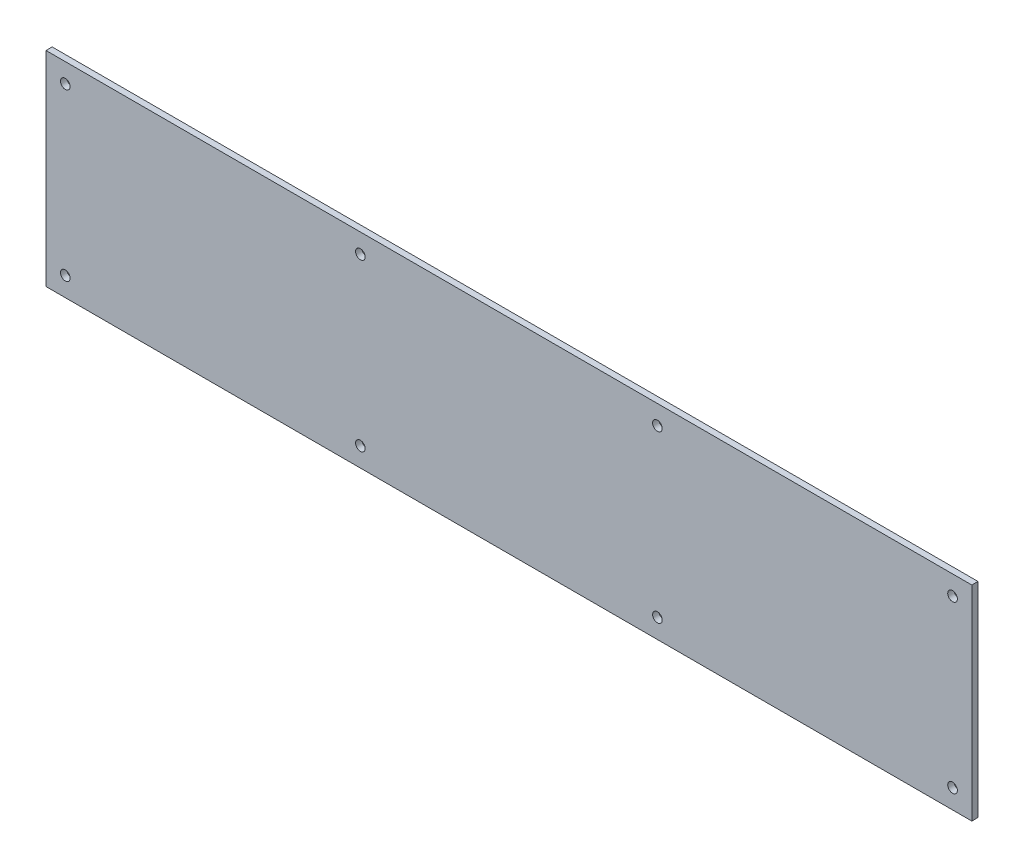
ISO-10303-21;
HEADER;
FILE_DESCRIPTION(('STEP AP214'),'2;1');
FILE_NAME('part.step','',(''),(''),'','','');
FILE_SCHEMA(('AUTOMOTIVE_DESIGN { 1 0 10303 214 1 1 1 1 }'));
ENDSEC;
DATA;
#1=APPLICATION_CONTEXT('core data for automotive mechanical design processes');
#2=APPLICATION_PROTOCOL_DEFINITION('international standard','automotive_design',2000,#1);
#3=PRODUCT_CONTEXT('',#1,'mechanical');
#4=PRODUCT('Part','Part','',(#3));
#5=PRODUCT_RELATED_PRODUCT_CATEGORY('part','',(#4));
#6=PRODUCT_DEFINITION_FORMATION('','',#4);
#7=PRODUCT_DEFINITION_CONTEXT('part definition',#1,'design');
#8=PRODUCT_DEFINITION('design','',#6,#7);
#9=PRODUCT_DEFINITION_SHAPE('','',#8);
#10=(LENGTH_UNIT() NAMED_UNIT(*) SI_UNIT(.MILLI.,.METRE.));
#11=(NAMED_UNIT(*) PLANE_ANGLE_UNIT() SI_UNIT($,.RADIAN.));
#12=(NAMED_UNIT(*) SI_UNIT($,.STERADIAN.) SOLID_ANGLE_UNIT());
#13=UNCERTAINTY_MEASURE_WITH_UNIT(LENGTH_MEASURE(1.E-05),#10,'distance_accuracy_value','');
#14=(GEOMETRIC_REPRESENTATION_CONTEXT(3) GLOBAL_UNCERTAINTY_ASSIGNED_CONTEXT((#13)) GLOBAL_UNIT_ASSIGNED_CONTEXT((#10,
#11,#12)) REPRESENTATION_CONTEXT('',''));
#15=CARTESIAN_POINT('',(0.,0.,0.));
#16=DIRECTION('',(0.,0.,1.));
#17=DIRECTION('',(1.,0.,0.));
#18=AXIS2_PLACEMENT_3D('',#15,#16,#17);
#19=CARTESIAN_POINT('',(-304.8,228.6,2.032));
#20=DIRECTION('',(1.,0.,0.));
#21=DIRECTION('',(0.,0.,-1.));
#22=AXIS2_PLACEMENT_3D('',#19,#20,#21);
#23=PLANE('',#22);
#24=DIRECTION('',(0.,-1.,0.));
#25=VECTOR('',#24,1.);
#26=CARTESIAN_POINT('',(-304.8,228.6,0.));
#27=LINE('',#26,#25);
#28=CARTESIAN_POINT('',(-304.8,228.6,0.));
#29=VERTEX_POINT('',#28);
#30=CARTESIAN_POINT('',(-304.8,161.29,0.));
#31=VERTEX_POINT('',#30);
#32=EDGE_CURVE('E94',#29,#31,#27,.T.);
#33=ORIENTED_EDGE('',*,*,#32,.T.);
#34=DIRECTION('',(0.,0.,-1.));
#35=VECTOR('',#34,1.);
#36=CARTESIAN_POINT('',(-304.8,161.29,2.032));
#37=LINE('',#36,#35);
#38=CARTESIAN_POINT('',(-304.8,161.29,2.032));
#39=VERTEX_POINT('',#38);
#40=EDGE_CURVE('E11',#39,#31,#37,.T.);
#41=ORIENTED_EDGE('',*,*,#40,.F.);
#42=DIRECTION('',(0.,-1.,0.));
#43=VECTOR('',#42,1.);
#44=CARTESIAN_POINT('',(-304.8,228.6,2.032));
#45=LINE('',#44,#43);
#46=CARTESIAN_POINT('',(-304.8,228.6,2.032));
#47=VERTEX_POINT('',#46);
#48=EDGE_CURVE('E82',#47,#39,#45,.T.);
#49=ORIENTED_EDGE('',*,*,#48,.F.);
#50=DIRECTION('',(0.,0.,-1.));
#51=VECTOR('',#50,1.);
#52=CARTESIAN_POINT('',(-304.8,228.6,2.032));
#53=LINE('',#52,#51);
#54=EDGE_CURVE('E90',#47,#29,#53,.T.);
#55=ORIENTED_EDGE('',*,*,#54,.T.);
#56=EDGE_LOOP('',(#33,#41,#49,#55));
#57=FACE_BOUND('',#56,.T.);
#58=ADVANCED_FACE('F31',(#57),#23,.F.);
#59=CARTESIAN_POINT('',(-304.8,161.29,2.032));
#60=DIRECTION('',(0.,1.,0.));
#61=DIRECTION('',(0.,0.,1.));
#62=AXIS2_PLACEMENT_3D('',#59,#60,#61);
#63=PLANE('',#62);
#64=DIRECTION('',(1.,0.,0.));
#65=VECTOR('',#64,1.);
#66=CARTESIAN_POINT('',(-304.8,161.29,0.));
#67=LINE('',#66,#65);
#68=CARTESIAN_POINT('',(0.,161.29,0.));
#69=VERTEX_POINT('',#68);
#70=EDGE_CURVE('E86',#31,#69,#67,.T.);
#71=ORIENTED_EDGE('',*,*,#70,.T.);
#72=DIRECTION('',(0.,0.,-1.));
#73=VECTOR('',#72,1.);
#74=CARTESIAN_POINT('',(0.,161.29,2.032));
#75=LINE('',#74,#73);
#76=CARTESIAN_POINT('',(0.,161.29,2.032));
#77=VERTEX_POINT('',#76);
#78=EDGE_CURVE('E39',#77,#69,#75,.T.);
#79=ORIENTED_EDGE('',*,*,#78,.F.);
#80=DIRECTION('',(1.,0.,0.));
#81=VECTOR('',#80,1.);
#82=CARTESIAN_POINT('',(-304.8,161.29,2.032));
#83=LINE('',#82,#81);
#84=EDGE_CURVE('E77',#39,#77,#83,.T.);
#85=ORIENTED_EDGE('',*,*,#84,.F.);
#86=ORIENTED_EDGE('',*,*,#40,.T.);
#87=EDGE_LOOP('',(#71,#79,#85,#86));
#88=FACE_BOUND('',#87,.T.);
#89=ADVANCED_FACE('F85',(#88),#63,.F.);
#90=CARTESIAN_POINT('',(0.,228.6,2.032));
#91=DIRECTION('',(-1.,0.,0.));
#92=DIRECTION('',(0.,0.,1.));
#93=AXIS2_PLACEMENT_3D('',#90,#91,#92);
#94=PLANE('',#93);
#95=DIRECTION('',(0.,1.,0.));
#96=VECTOR('',#95,1.);
#97=CARTESIAN_POINT('',(0.,228.6,0.));
#98=LINE('',#97,#96);
#99=CARTESIAN_POINT('',(0.,228.6,0.));
#100=VERTEX_POINT('',#99);
#101=EDGE_CURVE('E64',#69,#100,#98,.T.);
#102=ORIENTED_EDGE('',*,*,#101,.T.);
#103=DIRECTION('',(0.,0.,-1.));
#104=VECTOR('',#103,1.);
#105=CARTESIAN_POINT('',(0.,228.6,2.032));
#106=LINE('',#105,#104);
#107=CARTESIAN_POINT('',(0.,228.6,2.032));
#108=VERTEX_POINT('',#107);
#109=EDGE_CURVE('E87',#108,#100,#106,.T.);
#110=ORIENTED_EDGE('',*,*,#109,.F.);
#111=DIRECTION('',(0.,1.,0.));
#112=VECTOR('',#111,1.);
#113=CARTESIAN_POINT('',(0.,228.6,2.032));
#114=LINE('',#113,#112);
#115=EDGE_CURVE('E80',#77,#108,#114,.T.);
#116=ORIENTED_EDGE('',*,*,#115,.F.);
#117=ORIENTED_EDGE('',*,*,#78,.T.);
#118=EDGE_LOOP('',(#102,#110,#116,#117));
#119=FACE_BOUND('',#118,.T.);
#120=ADVANCED_FACE('F88',(#119),#94,.F.);
#121=CARTESIAN_POINT('',(-304.8,228.6,2.032));
#122=DIRECTION('',(0.,-1.,0.));
#123=DIRECTION('',(0.,0.,-1.));
#124=AXIS2_PLACEMENT_3D('',#121,#122,#123);
#125=PLANE('',#124);
#126=DIRECTION('',(-1.,0.,0.));
#127=VECTOR('',#126,1.);
#128=CARTESIAN_POINT('',(-304.8,228.6,0.));
#129=LINE('',#128,#127);
#130=EDGE_CURVE('E70',#100,#29,#129,.T.);
#131=ORIENTED_EDGE('',*,*,#130,.T.);
#132=ORIENTED_EDGE('',*,*,#54,.F.);
#133=DIRECTION('',(-1.,0.,0.));
#134=VECTOR('',#133,1.);
#135=CARTESIAN_POINT('',(-304.8,228.6,2.032));
#136=LINE('',#135,#134);
#137=EDGE_CURVE('E47',#108,#47,#136,.T.);
#138=ORIENTED_EDGE('',*,*,#137,.F.);
#139=ORIENTED_EDGE('',*,*,#109,.T.);
#140=EDGE_LOOP('',(#131,#132,#138,#139));
#141=FACE_BOUND('',#140,.T.);
#142=ADVANCED_FACE('F102',(#141),#125,.F.);
#143=CARTESIAN_POINT('',(-304.8,161.29,2.032));
#144=DIRECTION('',(0.,0.,1.));
#145=DIRECTION('',(1.,0.,0.));
#146=AXIS2_PLACEMENT_3D('',#143,#144,#145);
#147=PLANE('',#146);
#148=CARTESIAN_POINT('',(-103.505,222.25,2.032));
#149=DIRECTION('',(0.,0.,1.));
#150=DIRECTION('',(-1.,0.,0.));
#151=AXIS2_PLACEMENT_3D('',#148,#149,#150);
#152=CIRCLE('',#151,1.58749999999999);
#153=CARTESIAN_POINT('',(-105.0925,222.25,2.032));
#154=VERTEX_POINT('',#153);
#155=EDGE_CURVE('E150',#154,#154,#152,.T.);
#156=ORIENTED_EDGE('',*,*,#155,.F.);
#157=EDGE_LOOP('',(#156));
#158=FACE_BOUND('',#157,.T.);
#159=CARTESIAN_POINT('',(-6.34999999999997,222.25,2.032));
#160=DIRECTION('',(0.,0.,1.));
#161=DIRECTION('',(-1.,0.,0.));
#162=AXIS2_PLACEMENT_3D('',#159,#160,#161);
#163=CIRCLE('',#162,1.58750000000003);
#164=CARTESIAN_POINT('',(-7.9375,222.25,2.032));
#165=VERTEX_POINT('',#164);
#166=EDGE_CURVE('E144',#165,#165,#163,.T.);
#167=ORIENTED_EDGE('',*,*,#166,.F.);
#168=EDGE_LOOP('',(#167));
#169=FACE_BOUND('',#168,.T.);
#170=CARTESIAN_POINT('',(-6.34999999999997,167.64,2.032));
#171=DIRECTION('',(0.,0.,1.));
#172=DIRECTION('',(-1.,0.,0.));
#173=AXIS2_PLACEMENT_3D('',#170,#171,#172);
#174=CIRCLE('',#173,1.58750000000003);
#175=CARTESIAN_POINT('',(-7.93749999999999,167.64,2.032));
#176=VERTEX_POINT('',#175);
#177=EDGE_CURVE('E138',#176,#176,#174,.T.);
#178=ORIENTED_EDGE('',*,*,#177,.F.);
#179=EDGE_LOOP('',(#178));
#180=FACE_BOUND('',#179,.T.);
#181=CARTESIAN_POINT('',(-103.505,167.64,2.032));
#182=DIRECTION('',(0.,0.,1.));
#183=DIRECTION('',(-1.,0.,0.));
#184=AXIS2_PLACEMENT_3D('',#181,#182,#183);
#185=CIRCLE('',#184,1.58750000000005);
#186=CARTESIAN_POINT('',(-105.0925,167.64,2.032));
#187=VERTEX_POINT('',#186);
#188=EDGE_CURVE('E132',#187,#187,#185,.T.);
#189=ORIENTED_EDGE('',*,*,#188,.F.);
#190=EDGE_LOOP('',(#189));
#191=FACE_BOUND('',#190,.T.);
#192=CARTESIAN_POINT('',(-201.295,167.64,2.032));
#193=DIRECTION('',(0.,0.,1.));
#194=DIRECTION('',(1.,0.,0.));
#195=AXIS2_PLACEMENT_3D('',#192,#193,#194);
#196=CIRCLE('',#195,1.58750000000005);
#197=CARTESIAN_POINT('',(-199.7075,167.64,2.032));
#198=VERTEX_POINT('',#197);
#199=EDGE_CURVE('E126',#198,#198,#196,.T.);
#200=ORIENTED_EDGE('',*,*,#199,.F.);
#201=EDGE_LOOP('',(#200));
#202=FACE_BOUND('',#201,.T.);
#203=CARTESIAN_POINT('',(-298.45,167.64,2.032));
#204=DIRECTION('',(0.,0.,1.));
#205=DIRECTION('',(1.,0.,0.));
#206=AXIS2_PLACEMENT_3D('',#203,#204,#205);
#207=CIRCLE('',#206,1.58750000000004);
#208=CARTESIAN_POINT('',(-296.8625,167.64,2.032));
#209=VERTEX_POINT('',#208);
#210=EDGE_CURVE('E120',#209,#209,#207,.T.);
#211=ORIENTED_EDGE('',*,*,#210,.F.);
#212=EDGE_LOOP('',(#211));
#213=FACE_BOUND('',#212,.T.);
#214=CARTESIAN_POINT('',(-298.45,222.25,2.032));
#215=DIRECTION('',(0.,0.,1.));
#216=DIRECTION('',(1.,0.,0.));
#217=AXIS2_PLACEMENT_3D('',#214,#215,#216);
#218=CIRCLE('',#217,1.58750000000004);
#219=CARTESIAN_POINT('',(-296.8625,222.25,2.032));
#220=VERTEX_POINT('',#219);
#221=EDGE_CURVE('E114',#220,#220,#218,.T.);
#222=ORIENTED_EDGE('',*,*,#221,.F.);
#223=EDGE_LOOP('',(#222));
#224=FACE_BOUND('',#223,.T.);
#225=CARTESIAN_POINT('',(-201.295,222.25,2.032));
#226=DIRECTION('',(0.,0.,1.));
#227=DIRECTION('',(1.,0.,0.));
#228=AXIS2_PLACEMENT_3D('',#225,#226,#227);
#229=CIRCLE('',#228,1.58749999999999);
#230=CARTESIAN_POINT('',(-199.7075,222.25,2.032));
#231=VERTEX_POINT('',#230);
#232=EDGE_CURVE('E108',#231,#231,#229,.T.);
#233=ORIENTED_EDGE('',*,*,#232,.F.);
#234=EDGE_LOOP('',(#233));
#235=FACE_BOUND('',#234,.T.);
#236=ORIENTED_EDGE('',*,*,#48,.T.);
#237=ORIENTED_EDGE('',*,*,#84,.T.);
#238=ORIENTED_EDGE('',*,*,#115,.T.);
#239=ORIENTED_EDGE('',*,*,#137,.T.);
#240=EDGE_LOOP('',(#236,#237,#238,#239));
#241=FACE_BOUND('',#240,.T.);
#242=ADVANCED_FACE('F78',(#158,#169,#180,#191,#202,#213,#224,#235,#241),#147,.T.);
#243=CARTESIAN_POINT('',(-304.8,161.29,0.));
#244=DIRECTION('',(0.,0.,1.));
#245=DIRECTION('',(1.,0.,0.));
#246=AXIS2_PLACEMENT_3D('',#243,#244,#245);
#247=PLANE('',#246);
#248=CARTESIAN_POINT('',(-103.505,222.25,0.));
#249=DIRECTION('',(0.,0.,1.));
#250=DIRECTION('',(-1.,0.,0.));
#251=AXIS2_PLACEMENT_3D('',#248,#249,#250);
#252=CIRCLE('',#251,1.58749999999999);
#253=CARTESIAN_POINT('',(-105.0925,222.25,0.));
#254=VERTEX_POINT('',#253);
#255=EDGE_CURVE('E147',#254,#254,#252,.T.);
#256=ORIENTED_EDGE('',*,*,#255,.T.);
#257=EDGE_LOOP('',(#256));
#258=FACE_BOUND('',#257,.T.);
#259=CARTESIAN_POINT('',(-6.34999999999997,222.25,0.));
#260=DIRECTION('',(0.,0.,1.));
#261=DIRECTION('',(-1.,0.,0.));
#262=AXIS2_PLACEMENT_3D('',#259,#260,#261);
#263=CIRCLE('',#262,1.58750000000003);
#264=CARTESIAN_POINT('',(-7.9375,222.25,0.));
#265=VERTEX_POINT('',#264);
#266=EDGE_CURVE('E141',#265,#265,#263,.T.);
#267=ORIENTED_EDGE('',*,*,#266,.T.);
#268=EDGE_LOOP('',(#267));
#269=FACE_BOUND('',#268,.T.);
#270=CARTESIAN_POINT('',(-6.34999999999997,167.64,0.));
#271=DIRECTION('',(0.,0.,1.));
#272=DIRECTION('',(-1.,0.,0.));
#273=AXIS2_PLACEMENT_3D('',#270,#271,#272);
#274=CIRCLE('',#273,1.58750000000003);
#275=CARTESIAN_POINT('',(-7.93749999999999,167.64,0.));
#276=VERTEX_POINT('',#275);
#277=EDGE_CURVE('E135',#276,#276,#274,.T.);
#278=ORIENTED_EDGE('',*,*,#277,.T.);
#279=EDGE_LOOP('',(#278));
#280=FACE_BOUND('',#279,.T.);
#281=CARTESIAN_POINT('',(-103.505,167.64,0.));
#282=DIRECTION('',(0.,0.,1.));
#283=DIRECTION('',(-1.,0.,0.));
#284=AXIS2_PLACEMENT_3D('',#281,#282,#283);
#285=CIRCLE('',#284,1.58750000000005);
#286=CARTESIAN_POINT('',(-105.0925,167.64,0.));
#287=VERTEX_POINT('',#286);
#288=EDGE_CURVE('E129',#287,#287,#285,.T.);
#289=ORIENTED_EDGE('',*,*,#288,.T.);
#290=EDGE_LOOP('',(#289));
#291=FACE_BOUND('',#290,.T.);
#292=CARTESIAN_POINT('',(-201.295,167.64,0.));
#293=DIRECTION('',(0.,0.,1.));
#294=DIRECTION('',(1.,0.,0.));
#295=AXIS2_PLACEMENT_3D('',#292,#293,#294);
#296=CIRCLE('',#295,1.58750000000005);
#297=CARTESIAN_POINT('',(-199.7075,167.64,0.));
#298=VERTEX_POINT('',#297);
#299=EDGE_CURVE('E123',#298,#298,#296,.T.);
#300=ORIENTED_EDGE('',*,*,#299,.T.);
#301=EDGE_LOOP('',(#300));
#302=FACE_BOUND('',#301,.T.);
#303=CARTESIAN_POINT('',(-298.45,167.64,0.));
#304=DIRECTION('',(0.,0.,1.));
#305=DIRECTION('',(1.,0.,0.));
#306=AXIS2_PLACEMENT_3D('',#303,#304,#305);
#307=CIRCLE('',#306,1.58750000000004);
#308=CARTESIAN_POINT('',(-296.8625,167.64,0.));
#309=VERTEX_POINT('',#308);
#310=EDGE_CURVE('E117',#309,#309,#307,.T.);
#311=ORIENTED_EDGE('',*,*,#310,.T.);
#312=EDGE_LOOP('',(#311));
#313=FACE_BOUND('',#312,.T.);
#314=CARTESIAN_POINT('',(-298.45,222.25,0.));
#315=DIRECTION('',(0.,0.,1.));
#316=DIRECTION('',(1.,0.,0.));
#317=AXIS2_PLACEMENT_3D('',#314,#315,#316);
#318=CIRCLE('',#317,1.58750000000004);
#319=CARTESIAN_POINT('',(-296.8625,222.25,0.));
#320=VERTEX_POINT('',#319);
#321=EDGE_CURVE('E111',#320,#320,#318,.T.);
#322=ORIENTED_EDGE('',*,*,#321,.T.);
#323=EDGE_LOOP('',(#322));
#324=FACE_BOUND('',#323,.T.);
#325=CARTESIAN_POINT('',(-201.295,222.25,0.));
#326=DIRECTION('',(0.,0.,1.));
#327=DIRECTION('',(1.,0.,0.));
#328=AXIS2_PLACEMENT_3D('',#325,#326,#327);
#329=CIRCLE('',#328,1.58749999999999);
#330=CARTESIAN_POINT('',(-199.7075,222.25,0.));
#331=VERTEX_POINT('',#330);
#332=EDGE_CURVE('E97',#331,#331,#329,.T.);
#333=ORIENTED_EDGE('',*,*,#332,.T.);
#334=EDGE_LOOP('',(#333));
#335=FACE_BOUND('',#334,.T.);
#336=ORIENTED_EDGE('',*,*,#32,.F.);
#337=ORIENTED_EDGE('',*,*,#130,.F.);
#338=ORIENTED_EDGE('',*,*,#101,.F.);
#339=ORIENTED_EDGE('',*,*,#70,.F.);
#340=EDGE_LOOP('',(#336,#337,#338,#339));
#341=FACE_BOUND('',#340,.T.);
#342=ADVANCED_FACE('F105',(#258,#269,#280,#291,#302,#313,#324,#335,#341),#247,.F.);
#343=CARTESIAN_POINT('',(-201.295,222.25,0.));
#344=DIRECTION('',(0.,0.,1.));
#345=DIRECTION('',(1.,0.,0.));
#346=AXIS2_PLACEMENT_3D('',#343,#344,#345);
#347=CYLINDRICAL_SURFACE('',#346,1.58749999999999);
#348=ORIENTED_EDGE('',*,*,#332,.F.);
#349=EDGE_LOOP('',(#348));
#350=FACE_BOUND('',#349,.T.);
#351=ORIENTED_EDGE('',*,*,#232,.T.);
#352=EDGE_LOOP('',(#351));
#353=FACE_BOUND('',#352,.T.);
#354=ADVANCED_FACE('F182',(#350,#353),#347,.F.);
#355=CARTESIAN_POINT('',(-298.45,222.25,0.));
#356=DIRECTION('',(0.,0.,1.));
#357=DIRECTION('',(1.,0.,0.));
#358=AXIS2_PLACEMENT_3D('',#355,#356,#357);
#359=CYLINDRICAL_SURFACE('',#358,1.58750000000004);
#360=ORIENTED_EDGE('',*,*,#321,.F.);
#361=EDGE_LOOP('',(#360));
#362=FACE_BOUND('',#361,.T.);
#363=ORIENTED_EDGE('',*,*,#221,.T.);
#364=EDGE_LOOP('',(#363));
#365=FACE_BOUND('',#364,.T.);
#366=ADVANCED_FACE('F184',(#362,#365),#359,.F.);
#367=CARTESIAN_POINT('',(-298.45,167.64,0.));
#368=DIRECTION('',(0.,0.,1.));
#369=DIRECTION('',(1.,0.,0.));
#370=AXIS2_PLACEMENT_3D('',#367,#368,#369);
#371=CYLINDRICAL_SURFACE('',#370,1.58750000000004);
#372=ORIENTED_EDGE('',*,*,#310,.F.);
#373=EDGE_LOOP('',(#372));
#374=FACE_BOUND('',#373,.T.);
#375=ORIENTED_EDGE('',*,*,#210,.T.);
#376=EDGE_LOOP('',(#375));
#377=FACE_BOUND('',#376,.T.);
#378=ADVANCED_FACE('F191',(#374,#377),#371,.F.);
#379=CARTESIAN_POINT('',(-201.295,167.64,0.));
#380=DIRECTION('',(0.,0.,1.));
#381=DIRECTION('',(1.,0.,0.));
#382=AXIS2_PLACEMENT_3D('',#379,#380,#381);
#383=CYLINDRICAL_SURFACE('',#382,1.58750000000005);
#384=ORIENTED_EDGE('',*,*,#299,.F.);
#385=EDGE_LOOP('',(#384));
#386=FACE_BOUND('',#385,.T.);
#387=ORIENTED_EDGE('',*,*,#199,.T.);
#388=EDGE_LOOP('',(#387));
#389=FACE_BOUND('',#388,.T.);
#390=ADVANCED_FACE('F237',(#386,#389),#383,.F.);
#391=CARTESIAN_POINT('',(-103.505,167.64,0.));
#392=DIRECTION('',(0.,0.,1.));
#393=DIRECTION('',(1.,0.,0.));
#394=AXIS2_PLACEMENT_3D('',#391,#392,#393);
#395=CYLINDRICAL_SURFACE('',#394,1.58750000000005);
#396=ORIENTED_EDGE('',*,*,#288,.F.);
#397=EDGE_LOOP('',(#396));
#398=FACE_BOUND('',#397,.T.);
#399=ORIENTED_EDGE('',*,*,#188,.T.);
#400=EDGE_LOOP('',(#399));
#401=FACE_BOUND('',#400,.T.);
#402=ADVANCED_FACE('F247',(#398,#401),#395,.F.);
#403=CARTESIAN_POINT('',(-6.34999999999997,167.64,0.));
#404=DIRECTION('',(0.,0.,1.));
#405=DIRECTION('',(1.,0.,0.));
#406=AXIS2_PLACEMENT_3D('',#403,#404,#405);
#407=CYLINDRICAL_SURFACE('',#406,1.58750000000003);
#408=ORIENTED_EDGE('',*,*,#277,.F.);
#409=EDGE_LOOP('',(#408));
#410=FACE_BOUND('',#409,.T.);
#411=ORIENTED_EDGE('',*,*,#177,.T.);
#412=EDGE_LOOP('',(#411));
#413=FACE_BOUND('',#412,.T.);
#414=ADVANCED_FACE('F257',(#410,#413),#407,.F.);
#415=CARTESIAN_POINT('',(-6.34999999999997,222.25,0.));
#416=DIRECTION('',(0.,0.,1.));
#417=DIRECTION('',(1.,0.,0.));
#418=AXIS2_PLACEMENT_3D('',#415,#416,#417);
#419=CYLINDRICAL_SURFACE('',#418,1.58750000000003);
#420=ORIENTED_EDGE('',*,*,#266,.F.);
#421=EDGE_LOOP('',(#420));
#422=FACE_BOUND('',#421,.T.);
#423=ORIENTED_EDGE('',*,*,#166,.T.);
#424=EDGE_LOOP('',(#423));
#425=FACE_BOUND('',#424,.T.);
#426=ADVANCED_FACE('F161',(#422,#425),#419,.F.);
#427=CARTESIAN_POINT('',(-103.505,222.25,0.));
#428=DIRECTION('',(0.,0.,1.));
#429=DIRECTION('',(1.,0.,0.));
#430=AXIS2_PLACEMENT_3D('',#427,#428,#429);
#431=CYLINDRICAL_SURFACE('',#430,1.58749999999999);
#432=ORIENTED_EDGE('',*,*,#255,.F.);
#433=EDGE_LOOP('',(#432));
#434=FACE_BOUND('',#433,.T.);
#435=ORIENTED_EDGE('',*,*,#155,.T.);
#436=EDGE_LOOP('',(#435));
#437=FACE_BOUND('',#436,.T.);
#438=ADVANCED_FACE('F158',(#434,#437),#431,.F.);
#439=CLOSED_SHELL('',(#58,#89,#120,#142,#242,#342,#354,#366,#378,#390,#402,#414,#426,#438));
#440=MANIFOLD_SOLID_BREP('B2',#439);
#441=ADVANCED_BREP_SHAPE_REPRESENTATION('',(#18,#440),#14);
#442=SHAPE_DEFINITION_REPRESENTATION(#9,#441);
ENDSEC;
END-ISO-10303-21;
